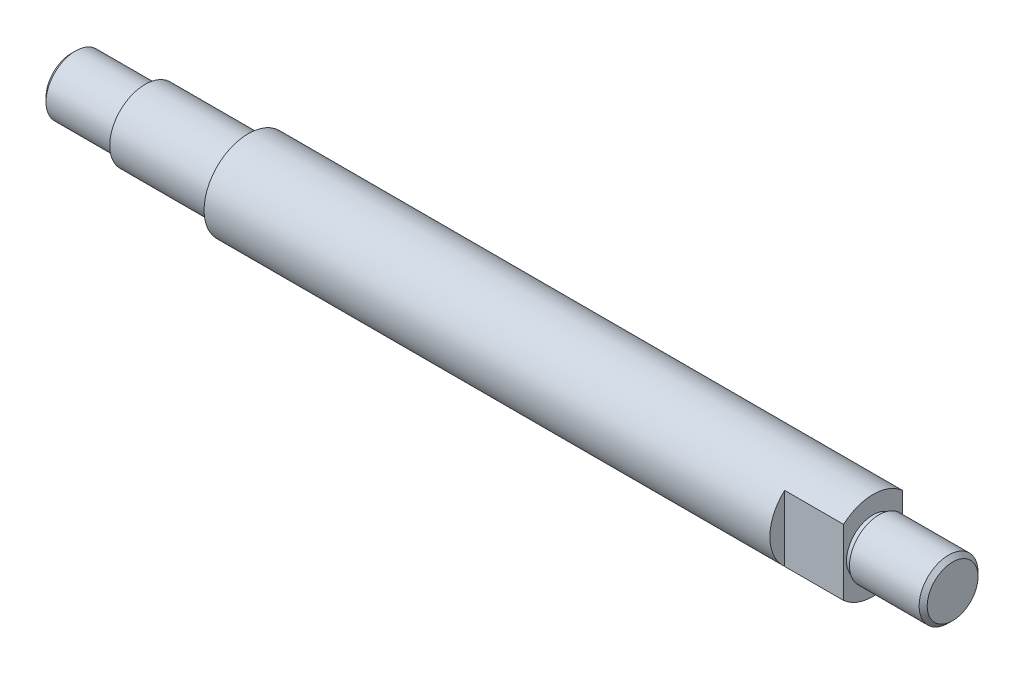
ISO-10303-21;
HEADER;
FILE_DESCRIPTION(('STEP AP214'),'2;1');
FILE_NAME('part.step','',(''),(''),'','','');
FILE_SCHEMA(('AUTOMOTIVE_DESIGN { 1 0 10303 214 1 1 1 1 }'));
ENDSEC;
DATA;
#1=APPLICATION_CONTEXT('core data for automotive mechanical design processes');
#2=APPLICATION_PROTOCOL_DEFINITION('international standard','automotive_design',2000,#1);
#3=PRODUCT_CONTEXT('',#1,'mechanical');
#4=PRODUCT('Part','Part','',(#3));
#5=PRODUCT_RELATED_PRODUCT_CATEGORY('part','',(#4));
#6=PRODUCT_DEFINITION_FORMATION('','',#4);
#7=PRODUCT_DEFINITION_CONTEXT('part definition',#1,'design');
#8=PRODUCT_DEFINITION('design','',#6,#7);
#9=PRODUCT_DEFINITION_SHAPE('','',#8);
#10=(LENGTH_UNIT() NAMED_UNIT(*) SI_UNIT(.MILLI.,.METRE.));
#11=(NAMED_UNIT(*) PLANE_ANGLE_UNIT() SI_UNIT($,.RADIAN.));
#12=(NAMED_UNIT(*) SI_UNIT($,.STERADIAN.) SOLID_ANGLE_UNIT());
#13=UNCERTAINTY_MEASURE_WITH_UNIT(LENGTH_MEASURE(1.E-05),#10,'distance_accuracy_value','');
#14=(GEOMETRIC_REPRESENTATION_CONTEXT(3) GLOBAL_UNCERTAINTY_ASSIGNED_CONTEXT((#13)) GLOBAL_UNIT_ASSIGNED_CONTEXT((#10,
#11,#12)) REPRESENTATION_CONTEXT('',''));
#15=CARTESIAN_POINT('',(0.,0.,0.));
#16=DIRECTION('',(0.,0.,1.));
#17=DIRECTION('',(1.,0.,0.));
#18=AXIS2_PLACEMENT_3D('',#15,#16,#17);
#19=CARTESIAN_POINT('',(0.,0.,0.));
#20=DIRECTION('',(1.,0.,0.));
#21=DIRECTION('',(0.,0.,-1.));
#22=AXIS2_PLACEMENT_3D('',#19,#20,#21);
#23=PLANE('',#22);
#24=CARTESIAN_POINT('',(0.,0.,0.));
#25=DIRECTION('',(1.,0.,0.));
#26=DIRECTION('',(0.,0.,-1.));
#27=AXIS2_PLACEMENT_3D('',#24,#25,#26);
#28=CIRCLE('',#27,8.62599999999988);
#29=CARTESIAN_POINT('',(0.,0.,-8.62599999999988));
#30=VERTEX_POINT('',#29);
#31=EDGE_CURVE('E151',#30,#30,#28,.F.);
#32=ORIENTED_EDGE('',*,*,#31,.T.);
#33=EDGE_LOOP('',(#32));
#34=FACE_BOUND('',#33,.T.);
#35=ADVANCED_FACE('F48',(#34),#23,.F.);
#36=CARTESIAN_POINT('',(-1007.97864266253,0.,0.));
#37=DIRECTION('',(-1.,0.,0.));
#38=DIRECTION('',(0.,0.,1.));
#39=AXIS2_PLACEMENT_3D('',#36,#37,#38);
#40=CYLINDRICAL_SURFACE('',#39,10.);
#41=CARTESIAN_POINT('',(1.37400000000021,0.,0.));
#42=DIRECTION('',(1.,0.,0.));
#43=DIRECTION('',(0.,0.,-1.));
#44=AXIS2_PLACEMENT_3D('',#41,#42,#43);
#45=CIRCLE('',#44,10.);
#46=CARTESIAN_POINT('',(1.37400000000021,0.,-10.));
#47=VERTEX_POINT('',#46);
#48=EDGE_CURVE('E154',#47,#47,#45,.T.);
#49=ORIENTED_EDGE('',*,*,#48,.T.);
#50=EDGE_LOOP('',(#49));
#51=FACE_BOUND('',#50,.T.);
#52=CARTESIAN_POINT('',(24.9999999999999,0.,0.));
#53=DIRECTION('',(-1.,0.,0.));
#54=DIRECTION('',(0.,0.,1.));
#55=AXIS2_PLACEMENT_3D('',#52,#53,#54);
#56=CIRCLE('',#55,10.);
#57=CARTESIAN_POINT('',(24.9999999999999,0.,10.));
#58=VERTEX_POINT('',#57);
#59=EDGE_CURVE('E142',#58,#58,#56,.T.);
#60=ORIENTED_EDGE('',*,*,#59,.T.);
#61=EDGE_LOOP('',(#60));
#62=FACE_BOUND('',#61,.T.);
#63=ADVANCED_FACE('F193',(#51,#62),#40,.T.);
#64=CARTESIAN_POINT('',(25.,10.,0.));
#65=DIRECTION('',(1.,0.,0.));
#66=DIRECTION('',(0.,0.,-1.));
#67=AXIS2_PLACEMENT_3D('',#64,#65,#66);
#68=PLANE('',#67);
#69=ORIENTED_EDGE('',*,*,#59,.F.);
#70=EDGE_LOOP('',(#69));
#71=FACE_BOUND('',#70,.T.);
#72=CARTESIAN_POINT('',(24.9999999999999,0.,0.));
#73=DIRECTION('',(-1.,0.,0.));
#74=DIRECTION('',(0.,0.,1.));
#75=AXIS2_PLACEMENT_3D('',#72,#73,#74);
#76=CIRCLE('',#75,12.);
#77=CARTESIAN_POINT('',(24.9999999999999,0.,12.));
#78=VERTEX_POINT('',#77);
#79=EDGE_CURVE('E139',#78,#78,#76,.T.);
#80=ORIENTED_EDGE('',*,*,#79,.T.);
#81=EDGE_LOOP('',(#80));
#82=FACE_BOUND('',#81,.T.);
#83=ADVANCED_FACE('F199',(#71,#82),#68,.F.);
#84=CARTESIAN_POINT('',(-1007.97864266253,0.,0.));
#85=DIRECTION('',(-1.,0.,0.));
#86=DIRECTION('',(0.,0.,1.));
#87=AXIS2_PLACEMENT_3D('',#84,#85,#86);
#88=CYLINDRICAL_SURFACE('',#87,12.);
#89=ORIENTED_EDGE('',*,*,#79,.F.);
#90=EDGE_LOOP('',(#89));
#91=FACE_BOUND('',#90,.T.);
#92=CARTESIAN_POINT('',(60.0000000000001,0.,0.));
#93=DIRECTION('',(-1.,0.,0.));
#94=DIRECTION('',(0.,0.,1.));
#95=AXIS2_PLACEMENT_3D('',#92,#93,#94);
#96=CIRCLE('',#95,12.);
#97=CARTESIAN_POINT('',(60.0000000000001,0.,12.));
#98=VERTEX_POINT('',#97);
#99=EDGE_CURVE('E136',#98,#98,#96,.T.);
#100=ORIENTED_EDGE('',*,*,#99,.T.);
#101=EDGE_LOOP('',(#100));
#102=FACE_BOUND('',#101,.T.);
#103=ADVANCED_FACE('F224',(#91,#102),#88,.T.);
#104=CARTESIAN_POINT('',(60.,12.,0.));
#105=DIRECTION('',(1.,0.,0.));
#106=DIRECTION('',(0.,0.,-1.));
#107=AXIS2_PLACEMENT_3D('',#104,#105,#106);
#108=PLANE('',#107);
#109=ORIENTED_EDGE('',*,*,#99,.F.);
#110=EDGE_LOOP('',(#109));
#111=FACE_BOUND('',#110,.T.);
#112=CARTESIAN_POINT('',(60.0000000000001,0.,0.));
#113=DIRECTION('',(-1.,0.,0.));
#114=DIRECTION('',(0.,0.,1.));
#115=AXIS2_PLACEMENT_3D('',#112,#113,#114);
#116=CIRCLE('',#115,15.);
#117=CARTESIAN_POINT('',(60.0000000000001,0.,15.));
#118=VERTEX_POINT('',#117);
#119=EDGE_CURVE('E133',#118,#118,#116,.T.);
#120=ORIENTED_EDGE('',*,*,#119,.T.);
#121=EDGE_LOOP('',(#120));
#122=FACE_BOUND('',#121,.T.);
#123=ADVANCED_FACE('F229',(#111,#122),#108,.F.);
#124=CARTESIAN_POINT('',(-1007.97864266253,0.,0.));
#125=DIRECTION('',(-1.,0.,0.));
#126=DIRECTION('',(0.,0.,1.));
#127=AXIS2_PLACEMENT_3D('',#124,#125,#126);
#128=CYLINDRICAL_SURFACE('',#127,15.);
#129=ORIENTED_EDGE('',*,*,#119,.F.);
#130=EDGE_LOOP('',(#129));
#131=FACE_BOUND('',#130,.T.);
#132=DIRECTION('',(-1.,0.,0.));
#133=VECTOR('',#132,1.);
#134=CARTESIAN_POINT('',(-1007.97864266253,-11.1803398874986,10.0000000000004));
#135=LINE('',#134,#133);
#136=CARTESIAN_POINT('',(272.,-11.1803398874989,10.));
#137=VERTEX_POINT('',#136);
#138=CARTESIAN_POINT('',(252.,-11.1803398874986,10.));
#139=VERTEX_POINT('',#138);
#140=EDGE_CURVE('E63',#137,#139,#135,.T.);
#141=ORIENTED_EDGE('',*,*,#140,.T.);
#142=CARTESIAN_POINT('',(252.,0.,0.));
#143=DIRECTION('',(-1.,0.,0.));
#144=DIRECTION('',(0.,0.,1.));
#145=AXIS2_PLACEMENT_3D('',#142,#143,#144);
#146=CIRCLE('',#145,15.);
#147=CARTESIAN_POINT('',(252.,11.1803398874986,10.));
#148=VERTEX_POINT('',#147);
#149=EDGE_CURVE('E13',#139,#148,#146,.T.);
#150=ORIENTED_EDGE('',*,*,#149,.T.);
#151=DIRECTION('',(-1.,0.,0.));
#152=VECTOR('',#151,1.);
#153=CARTESIAN_POINT('',(-1007.97864266253,11.1803398874986,10.0000000000004));
#154=LINE('',#153,#152);
#155=CARTESIAN_POINT('',(272.,11.1803398874989,10.));
#156=VERTEX_POINT('',#155);
#157=EDGE_CURVE('E100',#148,#156,#154,.F.);
#158=ORIENTED_EDGE('',*,*,#157,.T.);
#159=CARTESIAN_POINT('',(272.,0.,0.));
#160=DIRECTION('',(-1.,0.,0.));
#161=DIRECTION('',(0.,0.,1.));
#162=AXIS2_PLACEMENT_3D('',#159,#160,#161);
#163=CIRCLE('',#162,15.);
#164=CARTESIAN_POINT('',(272.,11.1803398874989,-10.));
#165=VERTEX_POINT('',#164);
#166=EDGE_CURVE('E131',#156,#165,#163,.T.);
#167=ORIENTED_EDGE('',*,*,#166,.T.);
#168=DIRECTION('',(-1.,0.,0.));
#169=VECTOR('',#168,1.);
#170=CARTESIAN_POINT('',(-1007.97864266253,11.1803398874986,-10.0000000000004));
#171=LINE('',#170,#169);
#172=CARTESIAN_POINT('',(252.,11.1803398874989,-10.));
#173=VERTEX_POINT('',#172);
#174=EDGE_CURVE('E120',#165,#173,#171,.T.);
#175=ORIENTED_EDGE('',*,*,#174,.T.);
#176=CARTESIAN_POINT('',(252.,0.,0.));
#177=DIRECTION('',(-1.,0.,0.));
#178=DIRECTION('',(0.,0.,1.));
#179=AXIS2_PLACEMENT_3D('',#176,#177,#178);
#180=CIRCLE('',#179,15.);
#181=CARTESIAN_POINT('',(252.,-11.1803398874989,-10.));
#182=VERTEX_POINT('',#181);
#183=EDGE_CURVE('E56',#173,#182,#180,.T.);
#184=ORIENTED_EDGE('',*,*,#183,.T.);
#185=DIRECTION('',(-1.,0.,0.));
#186=VECTOR('',#185,1.);
#187=CARTESIAN_POINT('',(-1007.97864266253,-11.1803398874986,-10.0000000000004));
#188=LINE('',#187,#186);
#189=CARTESIAN_POINT('',(272.,-11.1803398874989,-10.));
#190=VERTEX_POINT('',#189);
#191=EDGE_CURVE('E118',#182,#190,#188,.F.);
#192=ORIENTED_EDGE('',*,*,#191,.T.);
#193=EDGE_CURVE('E107',#190,#137,#163,.T.);
#194=ORIENTED_EDGE('',*,*,#193,.T.);
#195=EDGE_LOOP('',(#141,#150,#158,#167,#175,#184,#192,#194));
#196=FACE_BOUND('',#195,.T.);
#197=ADVANCED_FACE('F104',(#131,#196),#128,.T.);
#198=CARTESIAN_POINT('',(272.,15.,0.));
#199=DIRECTION('',(-1.,0.,0.));
#200=DIRECTION('',(0.,0.,1.));
#201=AXIS2_PLACEMENT_3D('',#198,#199,#200);
#202=PLANE('',#201);
#203=ORIENTED_EDGE('',*,*,#166,.F.);
#204=DIRECTION('',(0.,-1.,0.));
#205=VECTOR('',#204,1.);
#206=CARTESIAN_POINT('',(272.,15.,10.));
#207=LINE('',#206,#205);
#208=EDGE_CURVE('E101',#156,#137,#207,.T.);
#209=ORIENTED_EDGE('',*,*,#208,.T.);
#210=ORIENTED_EDGE('',*,*,#193,.F.);
#211=DIRECTION('',(0.,1.,0.));
#212=VECTOR('',#211,1.);
#213=CARTESIAN_POINT('',(272.,15.,-10.));
#214=LINE('',#213,#212);
#215=EDGE_CURVE('E111',#190,#165,#214,.T.);
#216=ORIENTED_EDGE('',*,*,#215,.T.);
#217=EDGE_LOOP('',(#203,#209,#210,#216));
#218=FACE_BOUND('',#217,.T.);
#219=CARTESIAN_POINT('',(272.,0.,0.));
#220=DIRECTION('',(-1.,0.,0.));
#221=DIRECTION('',(0.,0.,1.));
#222=AXIS2_PLACEMENT_3D('',#219,#220,#221);
#223=CIRCLE('',#222,9.);
#224=CARTESIAN_POINT('',(272.,0.,9.));
#225=VERTEX_POINT('',#224);
#226=EDGE_CURVE('E128',#225,#225,#223,.T.);
#227=ORIENTED_EDGE('',*,*,#226,.T.);
#228=EDGE_LOOP('',(#227));
#229=FACE_BOUND('',#228,.T.);
#230=ADVANCED_FACE('F165',(#218,#229),#202,.F.);
#231=CARTESIAN_POINT('',(-1007.97864266253,0.,0.));
#232=DIRECTION('',(-1.,0.,0.));
#233=DIRECTION('',(0.,0.,1.));
#234=AXIS2_PLACEMENT_3D('',#231,#232,#233);
#235=CYLINDRICAL_SURFACE('',#234,9.);
#236=ORIENTED_EDGE('',*,*,#226,.F.);
#237=EDGE_LOOP('',(#236));
#238=FACE_BOUND('',#237,.T.);
#239=CARTESIAN_POINT('',(274.,0.,0.));
#240=DIRECTION('',(-1.,0.,0.));
#241=DIRECTION('',(0.,0.,1.));
#242=AXIS2_PLACEMENT_3D('',#239,#240,#241);
#243=CIRCLE('',#242,9.);
#244=CARTESIAN_POINT('',(274.,0.,9.));
#245=VERTEX_POINT('',#244);
#246=EDGE_CURVE('E125',#245,#245,#243,.T.);
#247=ORIENTED_EDGE('',*,*,#246,.T.);
#248=EDGE_LOOP('',(#247));
#249=FACE_BOUND('',#248,.T.);
#250=ADVANCED_FACE('F168',(#238,#249),#235,.T.);
#251=CARTESIAN_POINT('',(274.,9.,0.));
#252=DIRECTION('',(1.,0.,0.));
#253=DIRECTION('',(0.,0.,-1.));
#254=AXIS2_PLACEMENT_3D('',#251,#252,#253);
#255=PLANE('',#254);
#256=ORIENTED_EDGE('',*,*,#246,.F.);
#257=EDGE_LOOP('',(#256));
#258=FACE_BOUND('',#257,.T.);
#259=CARTESIAN_POINT('',(274.,0.,0.));
#260=DIRECTION('',(-1.,0.,0.));
#261=DIRECTION('',(0.,0.,1.));
#262=AXIS2_PLACEMENT_3D('',#259,#260,#261);
#263=CIRCLE('',#262,10.);
#264=CARTESIAN_POINT('',(274.,0.,-10.));
#265=VERTEX_POINT('',#264);
#266=CARTESIAN_POINT('',(274.,0.,10.));
#267=VERTEX_POINT('',#266);
#268=EDGE_CURVE('E123',#265,#267,#263,.T.);
#269=ORIENTED_EDGE('',*,*,#268,.T.);
#270=EDGE_CURVE('E70',#267,#265,#263,.T.);
#271=ORIENTED_EDGE('',*,*,#270,.T.);
#272=EDGE_LOOP('',(#269,#271));
#273=FACE_BOUND('',#272,.T.);
#274=ADVANCED_FACE('F174',(#258,#273),#255,.F.);
#275=CARTESIAN_POINT('',(-1007.97864266253,0.,0.));
#276=DIRECTION('',(-1.,0.,0.));
#277=DIRECTION('',(0.,0.,1.));
#278=AXIS2_PLACEMENT_3D('',#275,#276,#277);
#279=CYLINDRICAL_SURFACE('',#278,10.);
#280=CARTESIAN_POINT('',(297.626,0.,0.));
#281=DIRECTION('',(-1.,0.,0.));
#282=DIRECTION('',(0.,0.,1.));
#283=AXIS2_PLACEMENT_3D('',#280,#281,#282);
#284=CIRCLE('',#283,10.);
#285=CARTESIAN_POINT('',(297.626,0.,10.));
#286=VERTEX_POINT('',#285);
#287=EDGE_CURVE('E145',#286,#286,#284,.T.);
#288=ORIENTED_EDGE('',*,*,#287,.T.);
#289=EDGE_LOOP('',(#288));
#290=FACE_BOUND('',#289,.T.);
#291=ORIENTED_EDGE('',*,*,#268,.F.);
#292=ORIENTED_EDGE('',*,*,#270,.F.);
#293=EDGE_LOOP('',(#291,#292));
#294=FACE_BOUND('',#293,.T.);
#295=ADVANCED_FACE('F180',(#290,#294),#279,.T.);
#296=CARTESIAN_POINT('',(299.,10.,0.));
#297=DIRECTION('',(-1.,0.,0.));
#298=DIRECTION('',(0.,0.,1.));
#299=AXIS2_PLACEMENT_3D('',#296,#297,#298);
#300=PLANE('',#299);
#301=CARTESIAN_POINT('',(299.,0.,0.));
#302=DIRECTION('',(-1.,0.,0.));
#303=DIRECTION('',(0.,0.,1.));
#304=AXIS2_PLACEMENT_3D('',#301,#302,#303);
#305=CIRCLE('',#304,8.62600000000011);
#306=CARTESIAN_POINT('',(299.,0.,8.62600000000011));
#307=VERTEX_POINT('',#306);
#308=EDGE_CURVE('E148',#307,#307,#305,.F.);
#309=ORIENTED_EDGE('',*,*,#308,.T.);
#310=EDGE_LOOP('',(#309));
#311=FACE_BOUND('',#310,.T.);
#312=ADVANCED_FACE('F183',(#311),#300,.F.);
#313=CARTESIAN_POINT('',(297.626,0.,0.));
#314=DIRECTION('',(-1.,0.,0.));
#315=DIRECTION('',(0.,0.,1.));
#316=AXIS2_PLACEMENT_3D('',#313,#314,#315);
#317=CONICAL_SURFACE('',#316,10.,0.785398163397496);
#318=ORIENTED_EDGE('',*,*,#308,.F.);
#319=EDGE_LOOP('',(#318));
#320=FACE_BOUND('',#319,.T.);
#321=ORIENTED_EDGE('',*,*,#287,.F.);
#322=EDGE_LOOP('',(#321));
#323=FACE_BOUND('',#322,.T.);
#324=ADVANCED_FACE('F189',(#320,#323),#317,.T.);
#325=CARTESIAN_POINT('',(0.,0.,0.));
#326=DIRECTION('',(1.,0.,0.));
#327=DIRECTION('',(0.,0.,-1.));
#328=AXIS2_PLACEMENT_3D('',#325,#326,#327);
#329=CONICAL_SURFACE('',#328,8.62599999999988,0.785398163397415);
#330=ORIENTED_EDGE('',*,*,#48,.F.);
#331=EDGE_LOOP('',(#330));
#332=FACE_BOUND('',#331,.T.);
#333=ORIENTED_EDGE('',*,*,#31,.F.);
#334=EDGE_LOOP('',(#333));
#335=FACE_BOUND('',#334,.T.);
#336=ADVANCED_FACE('F50',(#332,#335),#329,.T.);
#337=CARTESIAN_POINT('',(252.,-15.,-10.));
#338=DIRECTION('',(-1.,0.,0.));
#339=DIRECTION('',(0.,0.,1.));
#340=AXIS2_PLACEMENT_3D('',#337,#338,#339);
#341=PLANE('',#340);
#342=DIRECTION('',(0.,1.,0.));
#343=VECTOR('',#342,1.);
#344=CARTESIAN_POINT('',(252.,-15.,-10.));
#345=LINE('',#344,#343);
#346=EDGE_CURVE('E108',#182,#173,#345,.T.);
#347=ORIENTED_EDGE('',*,*,#346,.F.);
#348=ORIENTED_EDGE('',*,*,#183,.F.);
#349=EDGE_LOOP('',(#347,#348));
#350=FACE_BOUND('',#349,.T.);
#351=ADVANCED_FACE('F160',(#350),#341,.F.);
#352=CARTESIAN_POINT('',(274.,-15.,-10.));
#353=DIRECTION('',(0.,0.,1.));
#354=DIRECTION('',(1.,0.,0.));
#355=AXIS2_PLACEMENT_3D('',#352,#353,#354);
#356=PLANE('',#355);
#357=ORIENTED_EDGE('',*,*,#215,.F.);
#358=ORIENTED_EDGE('',*,*,#191,.F.);
#359=ORIENTED_EDGE('',*,*,#346,.T.);
#360=ORIENTED_EDGE('',*,*,#174,.F.);
#361=EDGE_LOOP('',(#357,#358,#359,#360));
#362=FACE_BOUND('',#361,.T.);
#363=ADVANCED_FACE('F162',(#362),#356,.F.);
#364=CARTESIAN_POINT('',(252.,-15.,10.));
#365=DIRECTION('',(-1.,0.,0.));
#366=DIRECTION('',(0.,0.,1.));
#367=AXIS2_PLACEMENT_3D('',#364,#365,#366);
#368=PLANE('',#367);
#369=ORIENTED_EDGE('',*,*,#149,.F.);
#370=DIRECTION('',(0.,1.,0.));
#371=VECTOR('',#370,1.);
#372=CARTESIAN_POINT('',(252.,-15.,10.));
#373=LINE('',#372,#371);
#374=EDGE_CURVE('E96',#139,#148,#373,.T.);
#375=ORIENTED_EDGE('',*,*,#374,.T.);
#376=EDGE_LOOP('',(#369,#375));
#377=FACE_BOUND('',#376,.T.);
#378=ADVANCED_FACE('F95',(#377),#368,.F.);
#379=CARTESIAN_POINT('',(274.,-15.,10.));
#380=DIRECTION('',(0.,0.,-1.));
#381=DIRECTION('',(-1.,0.,0.));
#382=AXIS2_PLACEMENT_3D('',#379,#380,#381);
#383=PLANE('',#382);
#384=ORIENTED_EDGE('',*,*,#208,.F.);
#385=ORIENTED_EDGE('',*,*,#157,.F.);
#386=ORIENTED_EDGE('',*,*,#374,.F.);
#387=ORIENTED_EDGE('',*,*,#140,.F.);
#388=EDGE_LOOP('',(#384,#385,#386,#387));
#389=FACE_BOUND('',#388,.T.);
#390=ADVANCED_FACE('F99',(#389),#383,.F.);
#391=CLOSED_SHELL('',(#35,#63,#83,#103,#123,#197,#230,#250,#274,#295,#312,#324,#336,#351,#363,
#378,#390));
#392=MANIFOLD_SOLID_BREP('B2',#391);
#393=ADVANCED_BREP_SHAPE_REPRESENTATION('',(#18,#392),#14);
#394=SHAPE_DEFINITION_REPRESENTATION(#9,#393);
ENDSEC;
END-ISO-10303-21;
